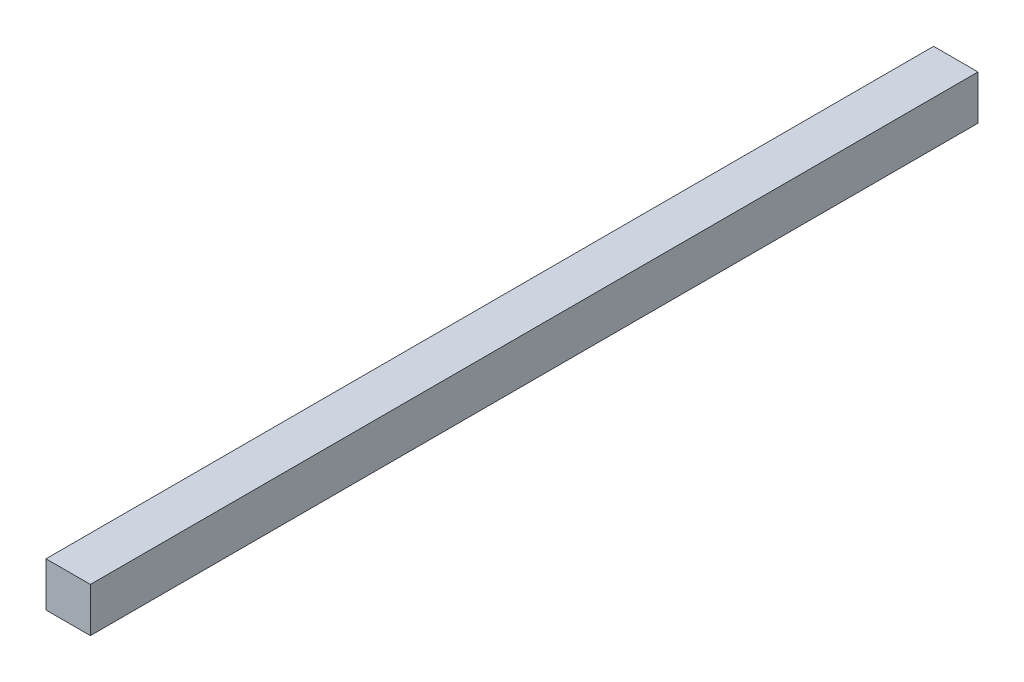
ISO-10303-21;
HEADER;
FILE_DESCRIPTION(('STEP AP214'),'2;1');
FILE_NAME('part.step','',(''),(''),'','','');
FILE_SCHEMA(('AUTOMOTIVE_DESIGN { 1 0 10303 214 1 1 1 1 }'));
ENDSEC;
DATA;
#1=APPLICATION_CONTEXT('core data for automotive mechanical design processes');
#2=APPLICATION_PROTOCOL_DEFINITION('international standard','automotive_design',2000,#1);
#3=PRODUCT_CONTEXT('',#1,'mechanical');
#4=PRODUCT('Part','Part','',(#3));
#5=PRODUCT_RELATED_PRODUCT_CATEGORY('part','',(#4));
#6=PRODUCT_DEFINITION_FORMATION('','',#4);
#7=PRODUCT_DEFINITION_CONTEXT('part definition',#1,'design');
#8=PRODUCT_DEFINITION('design','',#6,#7);
#9=PRODUCT_DEFINITION_SHAPE('','',#8);
#10=(LENGTH_UNIT() NAMED_UNIT(*) SI_UNIT(.MILLI.,.METRE.));
#11=(NAMED_UNIT(*) PLANE_ANGLE_UNIT() SI_UNIT($,.RADIAN.));
#12=(NAMED_UNIT(*) SI_UNIT($,.STERADIAN.) SOLID_ANGLE_UNIT());
#13=UNCERTAINTY_MEASURE_WITH_UNIT(LENGTH_MEASURE(1.E-05),#10,'distance_accuracy_value','');
#14=(GEOMETRIC_REPRESENTATION_CONTEXT(3) GLOBAL_UNCERTAINTY_ASSIGNED_CONTEXT((#13)) GLOBAL_UNIT_ASSIGNED_CONTEXT((#10,
#11,#12)) REPRESENTATION_CONTEXT('',''));
#15=CARTESIAN_POINT('',(0.,0.,0.));
#16=DIRECTION('',(0.,0.,1.));
#17=DIRECTION('',(1.,0.,0.));
#18=AXIS2_PLACEMENT_3D('',#15,#16,#17);
#19=CARTESIAN_POINT('',(15.,-15.,600.));
#20=DIRECTION('',(-1.,0.,0.));
#21=DIRECTION('',(0.,-1.,0.));
#22=AXIS2_PLACEMENT_3D('',#19,#20,#21);
#23=PLANE('',#22);
#24=DIRECTION('',(0.,1.,0.));
#25=VECTOR('',#24,1.);
#26=CARTESIAN_POINT('',(15.,-15.,0.));
#27=LINE('',#26,#25);
#28=CARTESIAN_POINT('',(15.,-15.,0.));
#29=VERTEX_POINT('',#28);
#30=CARTESIAN_POINT('',(15.,15.,0.));
#31=VERTEX_POINT('',#30);
#32=EDGE_CURVE('E104',#29,#31,#27,.T.);
#33=ORIENTED_EDGE('',*,*,#32,.T.);
#34=DIRECTION('',(0.,0.,-1.));
#35=VECTOR('',#34,1.);
#36=CARTESIAN_POINT('',(15.,15.,600.));
#37=LINE('',#36,#35);
#38=CARTESIAN_POINT('',(15.,15.,600.));
#39=VERTEX_POINT('',#38);
#40=EDGE_CURVE('E11',#39,#31,#37,.T.);
#41=ORIENTED_EDGE('',*,*,#40,.F.);
#42=DIRECTION('',(0.,1.,0.));
#43=VECTOR('',#42,1.);
#44=CARTESIAN_POINT('',(15.,-15.,600.));
#45=LINE('',#44,#43);
#46=CARTESIAN_POINT('',(15.,-15.,600.));
#47=VERTEX_POINT('',#46);
#48=EDGE_CURVE('E92',#47,#39,#45,.T.);
#49=ORIENTED_EDGE('',*,*,#48,.F.);
#50=DIRECTION('',(0.,0.,-1.));
#51=VECTOR('',#50,1.);
#52=CARTESIAN_POINT('',(15.,-15.,600.));
#53=LINE('',#52,#51);
#54=EDGE_CURVE('E100',#47,#29,#53,.T.);
#55=ORIENTED_EDGE('',*,*,#54,.T.);
#56=EDGE_LOOP('',(#33,#41,#49,#55));
#57=FACE_BOUND('',#56,.T.);
#58=ADVANCED_FACE('F41',(#57),#23,.F.);
#59=CARTESIAN_POINT('',(-15.,15.,600.));
#60=DIRECTION('',(0.,-1.,0.));
#61=DIRECTION('',(1.,0.,0.));
#62=AXIS2_PLACEMENT_3D('',#59,#60,#61);
#63=PLANE('',#62);
#64=DIRECTION('',(-1.,0.,0.));
#65=VECTOR('',#64,1.);
#66=CARTESIAN_POINT('',(-15.,15.,0.));
#67=LINE('',#66,#65);
#68=CARTESIAN_POINT('',(-15.,15.,0.));
#69=VERTEX_POINT('',#68);
#70=EDGE_CURVE('E96',#31,#69,#67,.T.);
#71=ORIENTED_EDGE('',*,*,#70,.T.);
#72=DIRECTION('',(0.,0.,-1.));
#73=VECTOR('',#72,1.);
#74=CARTESIAN_POINT('',(-15.,15.,600.));
#75=LINE('',#74,#73);
#76=CARTESIAN_POINT('',(-15.,15.,600.));
#77=VERTEX_POINT('',#76);
#78=EDGE_CURVE('E49',#77,#69,#75,.T.);
#79=ORIENTED_EDGE('',*,*,#78,.F.);
#80=DIRECTION('',(-1.,0.,0.));
#81=VECTOR('',#80,1.);
#82=CARTESIAN_POINT('',(-15.,15.,600.));
#83=LINE('',#82,#81);
#84=EDGE_CURVE('E87',#39,#77,#83,.T.);
#85=ORIENTED_EDGE('',*,*,#84,.F.);
#86=ORIENTED_EDGE('',*,*,#40,.T.);
#87=EDGE_LOOP('',(#71,#79,#85,#86));
#88=FACE_BOUND('',#87,.T.);
#89=ADVANCED_FACE('F95',(#88),#63,.F.);
#90=CARTESIAN_POINT('',(-15.,-15.,600.));
#91=DIRECTION('',(1.,0.,0.));
#92=DIRECTION('',(0.,0.,-1.));
#93=AXIS2_PLACEMENT_3D('',#90,#91,#92);
#94=PLANE('',#93);
#95=DIRECTION('',(0.,-1.,0.));
#96=VECTOR('',#95,1.);
#97=CARTESIAN_POINT('',(-15.,-15.,0.));
#98=LINE('',#97,#96);
#99=CARTESIAN_POINT('',(-15.,-15.,0.));
#100=VERTEX_POINT('',#99);
#101=EDGE_CURVE('E74',#69,#100,#98,.T.);
#102=ORIENTED_EDGE('',*,*,#101,.T.);
#103=DIRECTION('',(0.,0.,-1.));
#104=VECTOR('',#103,1.);
#105=CARTESIAN_POINT('',(-15.,-15.,600.));
#106=LINE('',#105,#104);
#107=CARTESIAN_POINT('',(-15.,-15.,600.));
#108=VERTEX_POINT('',#107);
#109=EDGE_CURVE('E97',#108,#100,#106,.T.);
#110=ORIENTED_EDGE('',*,*,#109,.F.);
#111=DIRECTION('',(0.,-1.,0.));
#112=VECTOR('',#111,1.);
#113=CARTESIAN_POINT('',(-15.,-15.,600.));
#114=LINE('',#113,#112);
#115=EDGE_CURVE('E90',#77,#108,#114,.T.);
#116=ORIENTED_EDGE('',*,*,#115,.F.);
#117=ORIENTED_EDGE('',*,*,#78,.T.);
#118=EDGE_LOOP('',(#102,#110,#116,#117));
#119=FACE_BOUND('',#118,.T.);
#120=ADVANCED_FACE('F98',(#119),#94,.F.);
#121=CARTESIAN_POINT('',(-15.,-15.,600.));
#122=DIRECTION('',(0.,1.,0.));
#123=DIRECTION('',(-1.,0.,0.));
#124=AXIS2_PLACEMENT_3D('',#121,#122,#123);
#125=PLANE('',#124);
#126=DIRECTION('',(1.,0.,0.));
#127=VECTOR('',#126,1.);
#128=CARTESIAN_POINT('',(-15.,-15.,0.));
#129=LINE('',#128,#127);
#130=EDGE_CURVE('E80',#100,#29,#129,.T.);
#131=ORIENTED_EDGE('',*,*,#130,.T.);
#132=ORIENTED_EDGE('',*,*,#54,.F.);
#133=DIRECTION('',(1.,0.,0.));
#134=VECTOR('',#133,1.);
#135=CARTESIAN_POINT('',(-15.,-15.,600.));
#136=LINE('',#135,#134);
#137=EDGE_CURVE('E57',#108,#47,#136,.T.);
#138=ORIENTED_EDGE('',*,*,#137,.F.);
#139=ORIENTED_EDGE('',*,*,#109,.T.);
#140=EDGE_LOOP('',(#131,#132,#138,#139));
#141=FACE_BOUND('',#140,.T.);
#142=ADVANCED_FACE('F111',(#141),#125,.F.);
#143=CARTESIAN_POINT('',(0.,0.,600.));
#144=DIRECTION('',(0.,0.,-1.));
#145=DIRECTION('',(-1.,0.,0.));
#146=AXIS2_PLACEMENT_3D('',#143,#144,#145);
#147=PLANE('',#146);
#148=ORIENTED_EDGE('',*,*,#48,.T.);
#149=ORIENTED_EDGE('',*,*,#84,.T.);
#150=ORIENTED_EDGE('',*,*,#115,.T.);
#151=ORIENTED_EDGE('',*,*,#137,.T.);
#152=EDGE_LOOP('',(#148,#149,#150,#151));
#153=FACE_BOUND('',#152,.T.);
#154=ADVANCED_FACE('F88',(#153),#147,.F.);
#155=CARTESIAN_POINT('',(0.,0.,0.));
#156=DIRECTION('',(0.,0.,-1.));
#157=DIRECTION('',(-1.,0.,0.));
#158=AXIS2_PLACEMENT_3D('',#155,#156,#157);
#159=PLANE('',#158);
#160=ORIENTED_EDGE('',*,*,#32,.F.);
#161=ORIENTED_EDGE('',*,*,#130,.F.);
#162=ORIENTED_EDGE('',*,*,#101,.F.);
#163=ORIENTED_EDGE('',*,*,#70,.F.);
#164=EDGE_LOOP('',(#160,#161,#162,#163));
#165=FACE_BOUND('',#164,.T.);
#166=ADVANCED_FACE('F114',(#165),#159,.T.);
#167=CLOSED_SHELL('',(#58,#89,#120,#142,#154,#166));
#168=MANIFOLD_SOLID_BREP('B2',#167);
#169=ADVANCED_BREP_SHAPE_REPRESENTATION('',(#18,#168),#14);
#170=SHAPE_DEFINITION_REPRESENTATION(#9,#169);
ENDSEC;
END-ISO-10303-21;
